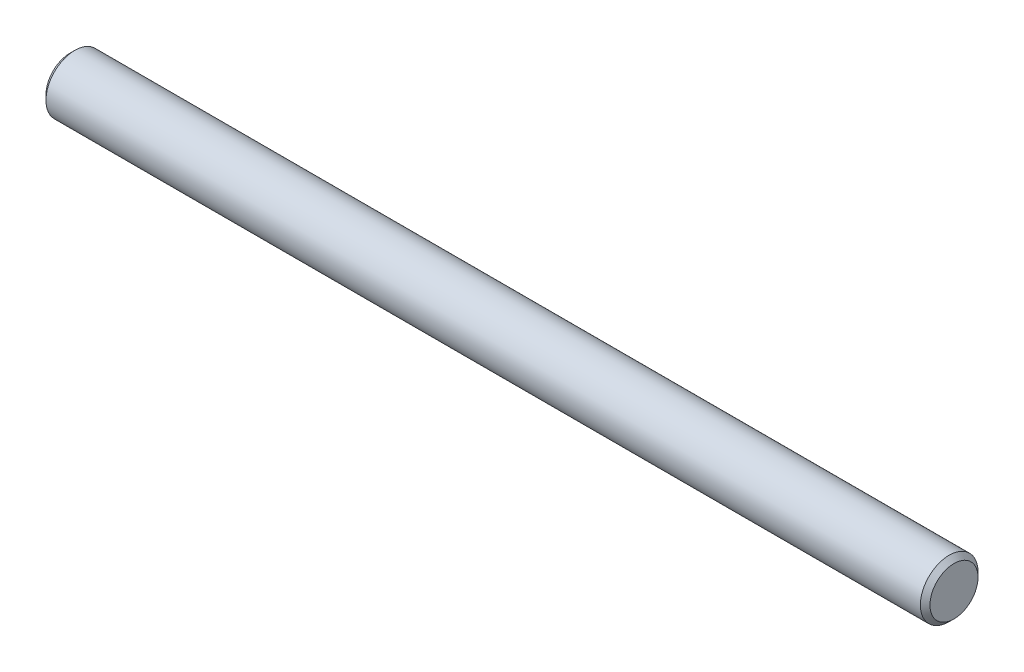
ISO-10303-21;
HEADER;
FILE_DESCRIPTION(('STEP AP214'),'2;1');
FILE_NAME('part.step','',(''),(''),'','','');
FILE_SCHEMA(('AUTOMOTIVE_DESIGN { 1 0 10303 214 1 1 1 1 }'));
ENDSEC;
DATA;
#1=APPLICATION_CONTEXT('core data for automotive mechanical design processes');
#2=APPLICATION_PROTOCOL_DEFINITION('international standard','automotive_design',2000,#1);
#3=PRODUCT_CONTEXT('',#1,'mechanical');
#4=PRODUCT('Part','Part','',(#3));
#5=PRODUCT_RELATED_PRODUCT_CATEGORY('part','',(#4));
#6=PRODUCT_DEFINITION_FORMATION('','',#4);
#7=PRODUCT_DEFINITION_CONTEXT('part definition',#1,'design');
#8=PRODUCT_DEFINITION('design','',#6,#7);
#9=PRODUCT_DEFINITION_SHAPE('','',#8);
#10=(LENGTH_UNIT() NAMED_UNIT(*) SI_UNIT(.MILLI.,.METRE.));
#11=(NAMED_UNIT(*) PLANE_ANGLE_UNIT() SI_UNIT($,.RADIAN.));
#12=(NAMED_UNIT(*) SI_UNIT($,.STERADIAN.) SOLID_ANGLE_UNIT());
#13=UNCERTAINTY_MEASURE_WITH_UNIT(LENGTH_MEASURE(1.E-05),#10,'distance_accuracy_value','');
#14=(GEOMETRIC_REPRESENTATION_CONTEXT(3) GLOBAL_UNCERTAINTY_ASSIGNED_CONTEXT((#13)) GLOBAL_UNIT_ASSIGNED_CONTEXT((#10,
#11,#12)) REPRESENTATION_CONTEXT('',''));
#15=CARTESIAN_POINT('',(0.,0.,0.));
#16=DIRECTION('',(0.,0.,1.));
#17=DIRECTION('',(1.,0.,0.));
#18=AXIS2_PLACEMENT_3D('',#15,#16,#17);
#19=CARTESIAN_POINT('',(184.,0.,0.));
#20=DIRECTION('',(-1.,0.,0.));
#21=DIRECTION('',(0.,0.,1.));
#22=AXIS2_PLACEMENT_3D('',#19,#20,#21);
#23=CYLINDRICAL_SURFACE('',#22,6.);
#24=CARTESIAN_POINT('',(183.,0.,0.));
#25=DIRECTION('',(1.,0.,0.));
#26=DIRECTION('',(0.,0.,-1.));
#27=AXIS2_PLACEMENT_3D('',#24,#25,#26);
#28=CIRCLE('',#27,6.);
#29=CARTESIAN_POINT('',(183.,0.,-6.));
#30=VERTEX_POINT('',#29);
#31=EDGE_CURVE('E37',#30,#30,#28,.F.);
#32=ORIENTED_EDGE('',*,*,#31,.T.);
#33=EDGE_LOOP('',(#32));
#34=FACE_BOUND('',#33,.T.);
#35=CARTESIAN_POINT('',(0.999999999999973,0.,0.));
#36=DIRECTION('',(1.,0.,0.));
#37=DIRECTION('',(0.,0.,-1.));
#38=AXIS2_PLACEMENT_3D('',#35,#36,#37);
#39=CIRCLE('',#38,6.);
#40=CARTESIAN_POINT('',(0.999999999999973,0.,-6.));
#41=VERTEX_POINT('',#40);
#42=EDGE_CURVE('E41',#41,#41,#39,.T.);
#43=ORIENTED_EDGE('',*,*,#42,.T.);
#44=EDGE_LOOP('',(#43));
#45=FACE_BOUND('',#44,.T.);
#46=ADVANCED_FACE('F30',(#34,#45),#23,.T.);
#47=CARTESIAN_POINT('',(184.,0.,0.));
#48=DIRECTION('',(1.,0.,0.));
#49=DIRECTION('',(0.,0.,-1.));
#50=AXIS2_PLACEMENT_3D('',#47,#48,#49);
#51=PLANE('',#50);
#52=CARTESIAN_POINT('',(184.,0.,0.));
#53=DIRECTION('',(1.,0.,0.));
#54=DIRECTION('',(0.,0.,-1.));
#55=AXIS2_PLACEMENT_3D('',#52,#53,#54);
#56=CIRCLE('',#55,5.00000000000003);
#57=CARTESIAN_POINT('',(184.,0.,-5.00000000000003));
#58=VERTEX_POINT('',#57);
#59=EDGE_CURVE('E45',#58,#58,#56,.T.);
#60=ORIENTED_EDGE('',*,*,#59,.T.);
#61=EDGE_LOOP('',(#60));
#62=FACE_BOUND('',#61,.T.);
#63=ADVANCED_FACE('F51',(#62),#51,.T.);
#64=CARTESIAN_POINT('',(0.,0.,0.));
#65=DIRECTION('',(1.,0.,0.));
#66=DIRECTION('',(0.,0.,-1.));
#67=AXIS2_PLACEMENT_3D('',#64,#65,#66);
#68=PLANE('',#67);
#69=CARTESIAN_POINT('',(0.,0.,0.));
#70=DIRECTION('',(1.,0.,0.));
#71=DIRECTION('',(0.,0.,-1.));
#72=AXIS2_PLACEMENT_3D('',#69,#70,#71);
#73=CIRCLE('',#72,5.00000000000001);
#74=CARTESIAN_POINT('',(0.,0.,-5.00000000000001));
#75=VERTEX_POINT('',#74);
#76=EDGE_CURVE('E10',#75,#75,#73,.F.);
#77=ORIENTED_EDGE('',*,*,#76,.T.);
#78=EDGE_LOOP('',(#77));
#79=FACE_BOUND('',#78,.T.);
#80=ADVANCED_FACE('F55',(#79),#68,.F.);
#81=CARTESIAN_POINT('',(184.,0.,0.));
#82=DIRECTION('',(-1.,0.,0.));
#83=DIRECTION('',(0.,0.,1.));
#84=AXIS2_PLACEMENT_3D('',#81,#82,#83);
#85=CONICAL_SURFACE('',#84,5.00000000000003,0.785398163397432);
#86=ORIENTED_EDGE('',*,*,#31,.F.);
#87=EDGE_LOOP('',(#86));
#88=FACE_BOUND('',#87,.T.);
#89=ORIENTED_EDGE('',*,*,#59,.F.);
#90=EDGE_LOOP('',(#89));
#91=FACE_BOUND('',#90,.T.);
#92=ADVANCED_FACE('F53',(#88,#91),#85,.T.);
#93=CARTESIAN_POINT('',(0.999999999999973,0.,0.));
#94=DIRECTION('',(1.,0.,0.));
#95=DIRECTION('',(0.,0.,-1.));
#96=AXIS2_PLACEMENT_3D('',#93,#94,#95);
#97=CONICAL_SURFACE('',#96,6.,0.78539816339746);
#98=ORIENTED_EDGE('',*,*,#76,.F.);
#99=EDGE_LOOP('',(#98));
#100=FACE_BOUND('',#99,.T.);
#101=ORIENTED_EDGE('',*,*,#42,.F.);
#102=EDGE_LOOP('',(#101));
#103=FACE_BOUND('',#102,.T.);
#104=ADVANCED_FACE('F32',(#100,#103),#97,.T.);
#105=CLOSED_SHELL('',(#46,#63,#80,#92,#104));
#106=MANIFOLD_SOLID_BREP('B2',#105);
#107=ADVANCED_BREP_SHAPE_REPRESENTATION('',(#18,#106),#14);
#108=SHAPE_DEFINITION_REPRESENTATION(#9,#107);
ENDSEC;
END-ISO-10303-21;
